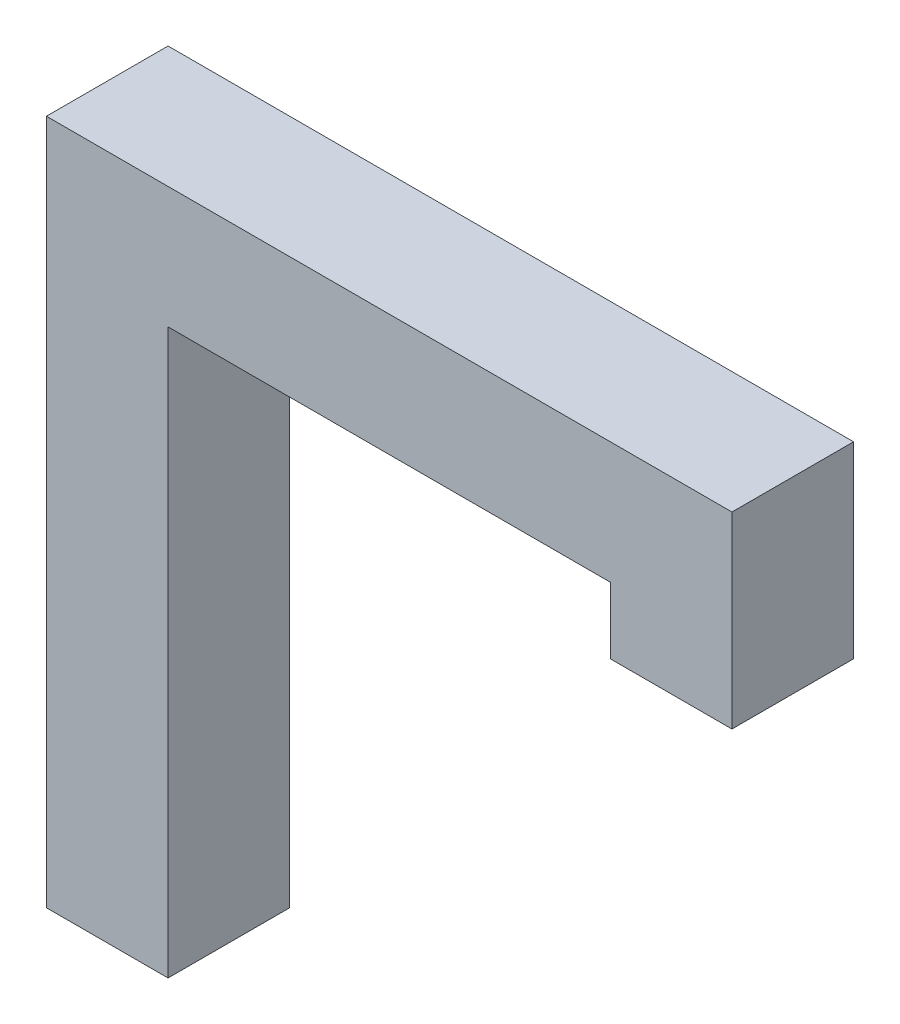
ISO-10303-21;
HEADER;
FILE_DESCRIPTION(('STEP AP214'),'2;1');
FILE_NAME('part.step','',(''),(''),'','','');
FILE_SCHEMA(('AUTOMOTIVE_DESIGN { 1 0 10303 214 1 1 1 1 }'));
ENDSEC;
DATA;
#1=APPLICATION_CONTEXT('core data for automotive mechanical design processes');
#2=APPLICATION_PROTOCOL_DEFINITION('international standard','automotive_design',2000,#1);
#3=PRODUCT_CONTEXT('',#1,'mechanical');
#4=PRODUCT('Part','Part','',(#3));
#5=PRODUCT_RELATED_PRODUCT_CATEGORY('part','',(#4));
#6=PRODUCT_DEFINITION_FORMATION('','',#4);
#7=PRODUCT_DEFINITION_CONTEXT('part definition',#1,'design');
#8=PRODUCT_DEFINITION('design','',#6,#7);
#9=PRODUCT_DEFINITION_SHAPE('','',#8);
#10=(LENGTH_UNIT() NAMED_UNIT(*) SI_UNIT(.MILLI.,.METRE.));
#11=(NAMED_UNIT(*) PLANE_ANGLE_UNIT() SI_UNIT($,.RADIAN.));
#12=(NAMED_UNIT(*) SI_UNIT($,.STERADIAN.) SOLID_ANGLE_UNIT());
#13=UNCERTAINTY_MEASURE_WITH_UNIT(LENGTH_MEASURE(1.E-05),#10,'distance_accuracy_value','');
#14=(GEOMETRIC_REPRESENTATION_CONTEXT(3) GLOBAL_UNCERTAINTY_ASSIGNED_CONTEXT((#13)) GLOBAL_UNIT_ASSIGNED_CONTEXT((#10,
#11,#12)) REPRESENTATION_CONTEXT('',''));
#15=CARTESIAN_POINT('',(0.,0.,0.));
#16=DIRECTION('',(0.,0.,1.));
#17=DIRECTION('',(1.,0.,0.));
#18=AXIS2_PLACEMENT_3D('',#15,#16,#17);
#19=CARTESIAN_POINT('',(0.,25.5,5.5));
#20=DIRECTION('',(-1.,0.,0.));
#21=DIRECTION('',(0.,-1.,0.));
#22=AXIS2_PLACEMENT_3D('',#19,#20,#21);
#23=PLANE('',#22);
#24=DIRECTION('',(0.,1.,0.));
#25=VECTOR('',#24,1.);
#26=CARTESIAN_POINT('',(0.,25.5,0.));
#27=LINE('',#26,#25);
#28=CARTESIAN_POINT('',(0.,0.,0.));
#29=VERTEX_POINT('',#28);
#30=CARTESIAN_POINT('',(0.,25.5,0.));
#31=VERTEX_POINT('',#30);
#32=EDGE_CURVE('E129',#29,#31,#27,.T.);
#33=ORIENTED_EDGE('',*,*,#32,.T.);
#34=DIRECTION('',(0.,0.,-1.));
#35=VECTOR('',#34,1.);
#36=CARTESIAN_POINT('',(0.,25.5,5.5));
#37=LINE('',#36,#35);
#38=CARTESIAN_POINT('',(0.,25.5,5.5));
#39=VERTEX_POINT('',#38);
#40=EDGE_CURVE('E11',#39,#31,#37,.T.);
#41=ORIENTED_EDGE('',*,*,#40,.F.);
#42=DIRECTION('',(0.,1.,0.));
#43=VECTOR('',#42,1.);
#44=CARTESIAN_POINT('',(0.,25.5,5.5));
#45=LINE('',#44,#43);
#46=CARTESIAN_POINT('',(0.,0.,5.5));
#47=VERTEX_POINT('',#46);
#48=EDGE_CURVE('E143',#47,#39,#45,.T.);
#49=ORIENTED_EDGE('',*,*,#48,.F.);
#50=DIRECTION('',(0.,0.,-1.));
#51=VECTOR('',#50,1.);
#52=CARTESIAN_POINT('',(0.,0.,5.5));
#53=LINE('',#52,#51);
#54=EDGE_CURVE('E125',#47,#29,#53,.T.);
#55=ORIENTED_EDGE('',*,*,#54,.T.);
#56=EDGE_LOOP('',(#33,#41,#49,#55));
#57=FACE_BOUND('',#56,.T.);
#58=ADVANCED_FACE('F33',(#57),#23,.F.);
#59=CARTESIAN_POINT('',(20.,25.5,5.5));
#60=DIRECTION('',(0.,1.,0.));
#61=DIRECTION('',(-1.,0.,0.));
#62=AXIS2_PLACEMENT_3D('',#59,#60,#61);
#63=PLANE('',#62);
#64=DIRECTION('',(1.,0.,0.));
#65=VECTOR('',#64,1.);
#66=CARTESIAN_POINT('',(20.,25.5,0.));
#67=LINE('',#66,#65);
#68=CARTESIAN_POINT('',(20.,25.5,0.));
#69=VERTEX_POINT('',#68);
#70=EDGE_CURVE('E132',#31,#69,#67,.T.);
#71=ORIENTED_EDGE('',*,*,#70,.T.);
#72=DIRECTION('',(0.,0.,-1.));
#73=VECTOR('',#72,1.);
#74=CARTESIAN_POINT('',(20.,25.5,5.5));
#75=LINE('',#74,#73);
#76=CARTESIAN_POINT('',(20.,25.5,5.5));
#77=VERTEX_POINT('',#76);
#78=EDGE_CURVE('E41',#77,#69,#75,.T.);
#79=ORIENTED_EDGE('',*,*,#78,.F.);
#80=DIRECTION('',(1.,0.,0.));
#81=VECTOR('',#80,1.);
#82=CARTESIAN_POINT('',(20.,25.5,5.5));
#83=LINE('',#82,#81);
#84=EDGE_CURVE('E92',#39,#77,#83,.T.);
#85=ORIENTED_EDGE('',*,*,#84,.F.);
#86=ORIENTED_EDGE('',*,*,#40,.T.);
#87=EDGE_LOOP('',(#71,#79,#85,#86));
#88=FACE_BOUND('',#87,.T.);
#89=ADVANCED_FACE('F178',(#88),#63,.F.);
#90=CARTESIAN_POINT('',(20.,22.5,5.5));
#91=DIRECTION('',(1.,0.,0.));
#92=DIRECTION('',(0.,0.,-1.));
#93=AXIS2_PLACEMENT_3D('',#90,#91,#92);
#94=PLANE('',#93);
#95=DIRECTION('',(0.,-1.,0.));
#96=VECTOR('',#95,1.);
#97=CARTESIAN_POINT('',(20.,22.5,0.));
#98=LINE('',#97,#96);
#99=CARTESIAN_POINT('',(20.,22.5,0.));
#100=VERTEX_POINT('',#99);
#101=EDGE_CURVE('E134',#69,#100,#98,.T.);
#102=ORIENTED_EDGE('',*,*,#101,.T.);
#103=DIRECTION('',(0.,0.,-1.));
#104=VECTOR('',#103,1.);
#105=CARTESIAN_POINT('',(20.,22.5,5.5));
#106=LINE('',#105,#104);
#107=CARTESIAN_POINT('',(20.,22.5,5.5));
#108=VERTEX_POINT('',#107);
#109=EDGE_CURVE('E150',#108,#100,#106,.T.);
#110=ORIENTED_EDGE('',*,*,#109,.F.);
#111=DIRECTION('',(0.,-1.,0.));
#112=VECTOR('',#111,1.);
#113=CARTESIAN_POINT('',(20.,22.5,5.5));
#114=LINE('',#113,#112);
#115=EDGE_CURVE('E158',#77,#108,#114,.T.);
#116=ORIENTED_EDGE('',*,*,#115,.F.);
#117=ORIENTED_EDGE('',*,*,#78,.T.);
#118=EDGE_LOOP('',(#102,#110,#116,#117));
#119=FACE_BOUND('',#118,.T.);
#120=ADVANCED_FACE('F156',(#119),#94,.F.);
#121=CARTESIAN_POINT('',(25.5,22.5,5.5));
#122=DIRECTION('',(0.,1.,0.));
#123=DIRECTION('',(0.,0.,1.));
#124=AXIS2_PLACEMENT_3D('',#121,#122,#123);
#125=PLANE('',#124);
#126=DIRECTION('',(1.,0.,0.));
#127=VECTOR('',#126,1.);
#128=CARTESIAN_POINT('',(25.5,22.5,0.));
#129=LINE('',#128,#127);
#130=CARTESIAN_POINT('',(25.5,22.5,0.));
#131=VERTEX_POINT('',#130);
#132=EDGE_CURVE('E136',#100,#131,#129,.T.);
#133=ORIENTED_EDGE('',*,*,#132,.T.);
#134=DIRECTION('',(0.,0.,-1.));
#135=VECTOR('',#134,1.);
#136=CARTESIAN_POINT('',(25.5,22.5,5.5));
#137=LINE('',#136,#135);
#138=CARTESIAN_POINT('',(25.5,22.5,5.5));
#139=VERTEX_POINT('',#138);
#140=EDGE_CURVE('E147',#139,#131,#137,.T.);
#141=ORIENTED_EDGE('',*,*,#140,.F.);
#142=DIRECTION('',(1.,0.,0.));
#143=VECTOR('',#142,1.);
#144=CARTESIAN_POINT('',(25.5,22.5,5.5));
#145=LINE('',#144,#143);
#146=EDGE_CURVE('E170',#108,#139,#145,.T.);
#147=ORIENTED_EDGE('',*,*,#146,.F.);
#148=ORIENTED_EDGE('',*,*,#109,.T.);
#149=EDGE_LOOP('',(#133,#141,#147,#148));
#150=FACE_BOUND('',#149,.T.);
#151=ADVANCED_FACE('F166',(#150),#125,.F.);
#152=CARTESIAN_POINT('',(25.5,31.,5.5));
#153=DIRECTION('',(-1.,0.,0.));
#154=DIRECTION('',(0.,0.,1.));
#155=AXIS2_PLACEMENT_3D('',#152,#153,#154);
#156=PLANE('',#155);
#157=DIRECTION('',(0.,1.,0.));
#158=VECTOR('',#157,1.);
#159=CARTESIAN_POINT('',(25.5,31.,0.));
#160=LINE('',#159,#158);
#161=CARTESIAN_POINT('',(25.5,31.,0.));
#162=VERTEX_POINT('',#161);
#163=EDGE_CURVE('E138',#131,#162,#160,.T.);
#164=ORIENTED_EDGE('',*,*,#163,.T.);
#165=DIRECTION('',(0.,0.,-1.));
#166=VECTOR('',#165,1.);
#167=CARTESIAN_POINT('',(25.5,31.,5.5));
#168=LINE('',#167,#166);
#169=CARTESIAN_POINT('',(25.5,31.,5.5));
#170=VERTEX_POINT('',#169);
#171=EDGE_CURVE('E120',#170,#162,#168,.T.);
#172=ORIENTED_EDGE('',*,*,#171,.F.);
#173=DIRECTION('',(0.,1.,0.));
#174=VECTOR('',#173,1.);
#175=CARTESIAN_POINT('',(25.5,31.,5.5));
#176=LINE('',#175,#174);
#177=EDGE_CURVE('E111',#139,#170,#176,.T.);
#178=ORIENTED_EDGE('',*,*,#177,.F.);
#179=ORIENTED_EDGE('',*,*,#140,.T.);
#180=EDGE_LOOP('',(#164,#172,#178,#179));
#181=FACE_BOUND('',#180,.T.);
#182=ADVANCED_FACE('F169',(#181),#156,.F.);
#183=CARTESIAN_POINT('',(-5.5,31.,5.5));
#184=DIRECTION('',(0.,-1.,0.));
#185=DIRECTION('',(0.,0.,-1.));
#186=AXIS2_PLACEMENT_3D('',#183,#184,#185);
#187=PLANE('',#186);
#188=DIRECTION('',(-1.,0.,0.));
#189=VECTOR('',#188,1.);
#190=CARTESIAN_POINT('',(-5.5,31.,0.));
#191=LINE('',#190,#189);
#192=CARTESIAN_POINT('',(-5.5,31.,0.));
#193=VERTEX_POINT('',#192);
#194=EDGE_CURVE('E119',#162,#193,#191,.T.);
#195=ORIENTED_EDGE('',*,*,#194,.T.);
#196=DIRECTION('',(0.,0.,-1.));
#197=VECTOR('',#196,1.);
#198=CARTESIAN_POINT('',(-5.5,31.,5.5));
#199=LINE('',#198,#197);
#200=CARTESIAN_POINT('',(-5.5,31.,5.5));
#201=VERTEX_POINT('',#200);
#202=EDGE_CURVE('E116',#201,#193,#199,.T.);
#203=ORIENTED_EDGE('',*,*,#202,.F.);
#204=DIRECTION('',(-1.,0.,0.));
#205=VECTOR('',#204,1.);
#206=CARTESIAN_POINT('',(-5.5,31.,5.5));
#207=LINE('',#206,#205);
#208=EDGE_CURVE('E105',#170,#201,#207,.T.);
#209=ORIENTED_EDGE('',*,*,#208,.F.);
#210=ORIENTED_EDGE('',*,*,#171,.T.);
#211=EDGE_LOOP('',(#195,#203,#209,#210));
#212=FACE_BOUND('',#211,.T.);
#213=ADVANCED_FACE('F117',(#212),#187,.F.);
#214=CARTESIAN_POINT('',(-5.5,0.,5.5));
#215=DIRECTION('',(1.,0.,0.));
#216=DIRECTION('',(0.,0.,-1.));
#217=AXIS2_PLACEMENT_3D('',#214,#215,#216);
#218=PLANE('',#217);
#219=DIRECTION('',(0.,-1.,0.));
#220=VECTOR('',#219,1.);
#221=CARTESIAN_POINT('',(-5.5,0.,0.));
#222=LINE('',#221,#220);
#223=CARTESIAN_POINT('',(-5.5,0.,0.));
#224=VERTEX_POINT('',#223);
#225=EDGE_CURVE('E78',#193,#224,#222,.T.);
#226=ORIENTED_EDGE('',*,*,#225,.T.);
#227=DIRECTION('',(0.,0.,-1.));
#228=VECTOR('',#227,1.);
#229=CARTESIAN_POINT('',(-5.5,0.,5.5));
#230=LINE('',#229,#228);
#231=CARTESIAN_POINT('',(-5.5,0.,5.5));
#232=VERTEX_POINT('',#231);
#233=EDGE_CURVE('E121',#232,#224,#230,.T.);
#234=ORIENTED_EDGE('',*,*,#233,.F.);
#235=DIRECTION('',(0.,-1.,0.));
#236=VECTOR('',#235,1.);
#237=CARTESIAN_POINT('',(-5.5,0.,5.5));
#238=LINE('',#237,#236);
#239=EDGE_CURVE('E109',#201,#232,#238,.T.);
#240=ORIENTED_EDGE('',*,*,#239,.F.);
#241=ORIENTED_EDGE('',*,*,#202,.T.);
#242=EDGE_LOOP('',(#226,#234,#240,#241));
#243=FACE_BOUND('',#242,.T.);
#244=ADVANCED_FACE('F123',(#243),#218,.F.);
#245=CARTESIAN_POINT('',(0.,0.,5.5));
#246=DIRECTION('',(0.,1.,0.));
#247=DIRECTION('',(0.,0.,1.));
#248=AXIS2_PLACEMENT_3D('',#245,#246,#247);
#249=PLANE('',#248);
#250=DIRECTION('',(1.,0.,0.));
#251=VECTOR('',#250,1.);
#252=CARTESIAN_POINT('',(0.,0.,0.));
#253=LINE('',#252,#251);
#254=EDGE_CURVE('E84',#224,#29,#253,.T.);
#255=ORIENTED_EDGE('',*,*,#254,.T.);
#256=ORIENTED_EDGE('',*,*,#54,.F.);
#257=DIRECTION('',(1.,0.,0.));
#258=VECTOR('',#257,1.);
#259=CARTESIAN_POINT('',(0.,0.,5.5));
#260=LINE('',#259,#258);
#261=EDGE_CURVE('E49',#232,#47,#260,.T.);
#262=ORIENTED_EDGE('',*,*,#261,.F.);
#263=ORIENTED_EDGE('',*,*,#233,.T.);
#264=EDGE_LOOP('',(#255,#256,#262,#263));
#265=FACE_BOUND('',#264,.T.);
#266=ADVANCED_FACE('F194',(#265),#249,.F.);
#267=CARTESIAN_POINT('',(0.,0.,5.5));
#268=DIRECTION('',(0.,0.,-1.));
#269=DIRECTION('',(-1.,0.,0.));
#270=AXIS2_PLACEMENT_3D('',#267,#268,#269);
#271=PLANE('',#270);
#272=ORIENTED_EDGE('',*,*,#48,.T.);
#273=ORIENTED_EDGE('',*,*,#84,.T.);
#274=ORIENTED_EDGE('',*,*,#115,.T.);
#275=ORIENTED_EDGE('',*,*,#146,.T.);
#276=ORIENTED_EDGE('',*,*,#177,.T.);
#277=ORIENTED_EDGE('',*,*,#208,.T.);
#278=ORIENTED_EDGE('',*,*,#239,.T.);
#279=ORIENTED_EDGE('',*,*,#261,.T.);
#280=EDGE_LOOP('',(#272,#273,#274,#275,#276,#277,#278,#279));
#281=FACE_BOUND('',#280,.T.);
#282=ADVANCED_FACE('F107',(#281),#271,.F.);
#283=CARTESIAN_POINT('',(0.,0.,0.));
#284=DIRECTION('',(0.,0.,-1.));
#285=DIRECTION('',(-1.,0.,0.));
#286=AXIS2_PLACEMENT_3D('',#283,#284,#285);
#287=PLANE('',#286);
#288=ORIENTED_EDGE('',*,*,#32,.F.);
#289=ORIENTED_EDGE('',*,*,#254,.F.);
#290=ORIENTED_EDGE('',*,*,#225,.F.);
#291=ORIENTED_EDGE('',*,*,#194,.F.);
#292=ORIENTED_EDGE('',*,*,#163,.F.);
#293=ORIENTED_EDGE('',*,*,#132,.F.);
#294=ORIENTED_EDGE('',*,*,#101,.F.);
#295=ORIENTED_EDGE('',*,*,#70,.F.);
#296=EDGE_LOOP('',(#288,#289,#290,#291,#292,#293,#294,#295));
#297=FACE_BOUND('',#296,.T.);
#298=ADVANCED_FACE('F162',(#297),#287,.T.);
#299=CLOSED_SHELL('',(#58,#89,#120,#151,#182,#213,#244,#266,#282,#298));
#300=MANIFOLD_SOLID_BREP('B2',#299);
#301=ADVANCED_BREP_SHAPE_REPRESENTATION('',(#18,#300),#14);
#302=SHAPE_DEFINITION_REPRESENTATION(#9,#301);
ENDSEC;
END-ISO-10303-21;
